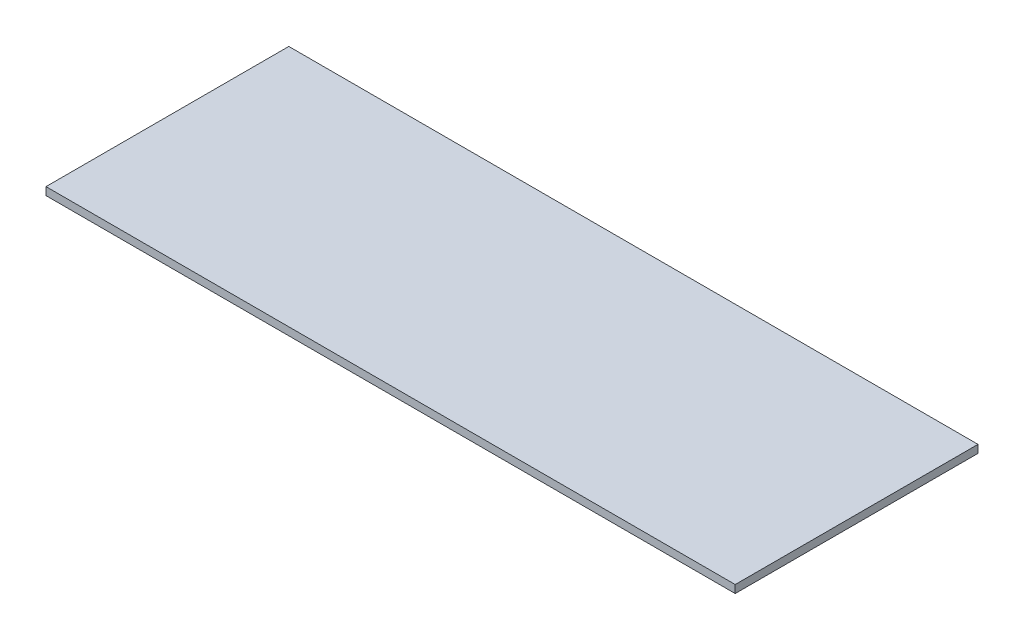
ISO-10303-21;
HEADER;
FILE_DESCRIPTION(('STEP AP214'),'2;1');
FILE_NAME('part.step','',(''),(''),'','','');
FILE_SCHEMA(('AUTOMOTIVE_DESIGN { 1 0 10303 214 1 1 1 1 }'));
ENDSEC;
DATA;
#1=APPLICATION_CONTEXT('core data for automotive mechanical design processes');
#2=APPLICATION_PROTOCOL_DEFINITION('international standard','automotive_design',2000,#1);
#3=PRODUCT_CONTEXT('',#1,'mechanical');
#4=PRODUCT('Part','Part','',(#3));
#5=PRODUCT_RELATED_PRODUCT_CATEGORY('part','',(#4));
#6=PRODUCT_DEFINITION_FORMATION('','',#4);
#7=PRODUCT_DEFINITION_CONTEXT('part definition',#1,'design');
#8=PRODUCT_DEFINITION('design','',#6,#7);
#9=PRODUCT_DEFINITION_SHAPE('','',#8);
#10=(LENGTH_UNIT() NAMED_UNIT(*) SI_UNIT(.MILLI.,.METRE.));
#11=(NAMED_UNIT(*) PLANE_ANGLE_UNIT() SI_UNIT($,.RADIAN.));
#12=(NAMED_UNIT(*) SI_UNIT($,.STERADIAN.) SOLID_ANGLE_UNIT());
#13=UNCERTAINTY_MEASURE_WITH_UNIT(LENGTH_MEASURE(1.E-05),#10,'distance_accuracy_value','');
#14=(GEOMETRIC_REPRESENTATION_CONTEXT(3) GLOBAL_UNCERTAINTY_ASSIGNED_CONTEXT((#13)) GLOBAL_UNIT_ASSIGNED_CONTEXT((#10,
#11,#12)) REPRESENTATION_CONTEXT('',''));
#15=CARTESIAN_POINT('',(0.,0.,0.));
#16=DIRECTION('',(0.,0.,1.));
#17=DIRECTION('',(1.,0.,0.));
#18=AXIS2_PLACEMENT_3D('',#15,#16,#17);
#19=CARTESIAN_POINT('',(0.,5.,0.));
#20=DIRECTION('',(1.,0.,0.));
#21=DIRECTION('',(0.,0.,-1.));
#22=AXIS2_PLACEMENT_3D('',#19,#20,#21);
#23=PLANE('',#22);
#24=DIRECTION('',(0.,0.,1.));
#25=VECTOR('',#24,1.);
#26=CARTESIAN_POINT('',(0.,0.,0.));
#27=LINE('',#26,#25);
#28=CARTESIAN_POINT('',(0.,0.,-155.));
#29=VERTEX_POINT('',#28);
#30=CARTESIAN_POINT('',(0.,0.,0.));
#31=VERTEX_POINT('',#30);
#32=EDGE_CURVE('E111',#29,#31,#27,.T.);
#33=ORIENTED_EDGE('',*,*,#32,.T.);
#34=DIRECTION('',(0.,-1.,0.));
#35=VECTOR('',#34,1.);
#36=CARTESIAN_POINT('',(0.,5.,0.));
#37=LINE('',#36,#35);
#38=CARTESIAN_POINT('',(0.,5.,0.));
#39=VERTEX_POINT('',#38);
#40=EDGE_CURVE('E11',#39,#31,#37,.T.);
#41=ORIENTED_EDGE('',*,*,#40,.F.);
#42=DIRECTION('',(0.,0.,1.));
#43=VECTOR('',#42,1.);
#44=CARTESIAN_POINT('',(0.,5.,0.));
#45=LINE('',#44,#43);
#46=CARTESIAN_POINT('',(0.,5.,-155.));
#47=VERTEX_POINT('',#46);
#48=EDGE_CURVE('E100',#47,#39,#45,.T.);
#49=ORIENTED_EDGE('',*,*,#48,.F.);
#50=DIRECTION('',(0.,-1.,0.));
#51=VECTOR('',#50,1.);
#52=CARTESIAN_POINT('',(0.,5.,-155.));
#53=LINE('',#52,#51);
#54=EDGE_CURVE('E108',#47,#29,#53,.T.);
#55=ORIENTED_EDGE('',*,*,#54,.T.);
#56=EDGE_LOOP('',(#33,#41,#49,#55));
#57=FACE_BOUND('',#56,.T.);
#58=ADVANCED_FACE('F44',(#57),#23,.F.);
#59=CARTESIAN_POINT('',(0.,5.,0.));
#60=DIRECTION('',(0.,0.,-1.));
#61=DIRECTION('',(-1.,0.,0.));
#62=AXIS2_PLACEMENT_3D('',#59,#60,#61);
#63=PLANE('',#62);
#64=DIRECTION('',(1.,0.,0.));
#65=VECTOR('',#64,1.);
#66=CARTESIAN_POINT('',(0.,0.,0.));
#67=LINE('',#66,#65);
#68=CARTESIAN_POINT('',(440.,0.,0.));
#69=VERTEX_POINT('',#68);
#70=EDGE_CURVE('E105',#31,#69,#67,.T.);
#71=ORIENTED_EDGE('',*,*,#70,.T.);
#72=DIRECTION('',(0.,-1.,0.));
#73=VECTOR('',#72,1.);
#74=CARTESIAN_POINT('',(440.,5.,0.));
#75=LINE('',#74,#73);
#76=CARTESIAN_POINT('',(440.,5.,0.));
#77=VERTEX_POINT('',#76);
#78=EDGE_CURVE('E53',#77,#69,#75,.T.);
#79=ORIENTED_EDGE('',*,*,#78,.F.);
#80=DIRECTION('',(1.,0.,0.));
#81=VECTOR('',#80,1.);
#82=CARTESIAN_POINT('',(0.,5.,0.));
#83=LINE('',#82,#81);
#84=EDGE_CURVE('E95',#39,#77,#83,.T.);
#85=ORIENTED_EDGE('',*,*,#84,.F.);
#86=ORIENTED_EDGE('',*,*,#40,.T.);
#87=EDGE_LOOP('',(#71,#79,#85,#86));
#88=FACE_BOUND('',#87,.T.);
#89=ADVANCED_FACE('F102',(#88),#63,.F.);
#90=CARTESIAN_POINT('',(440.,5.,0.));
#91=DIRECTION('',(-1.,0.,0.));
#92=DIRECTION('',(0.,0.,1.));
#93=AXIS2_PLACEMENT_3D('',#90,#91,#92);
#94=PLANE('',#93);
#95=DIRECTION('',(0.,0.,-1.));
#96=VECTOR('',#95,1.);
#97=CARTESIAN_POINT('',(440.,0.,0.));
#98=LINE('',#97,#96);
#99=CARTESIAN_POINT('',(440.,0.,-155.));
#100=VERTEX_POINT('',#99);
#101=EDGE_CURVE('E80',#69,#100,#98,.T.);
#102=ORIENTED_EDGE('',*,*,#101,.T.);
#103=DIRECTION('',(0.,-1.,0.));
#104=VECTOR('',#103,1.);
#105=CARTESIAN_POINT('',(440.,5.,-155.));
#106=LINE('',#105,#104);
#107=CARTESIAN_POINT('',(440.,5.,-155.));
#108=VERTEX_POINT('',#107);
#109=EDGE_CURVE('E101',#108,#100,#106,.T.);
#110=ORIENTED_EDGE('',*,*,#109,.F.);
#111=DIRECTION('',(0.,0.,-1.));
#112=VECTOR('',#111,1.);
#113=CARTESIAN_POINT('',(440.,5.,0.));
#114=LINE('',#113,#112);
#115=EDGE_CURVE('E94',#77,#108,#114,.T.);
#116=ORIENTED_EDGE('',*,*,#115,.F.);
#117=ORIENTED_EDGE('',*,*,#78,.T.);
#118=EDGE_LOOP('',(#102,#110,#116,#117));
#119=FACE_BOUND('',#118,.T.);
#120=ADVANCED_FACE('F103',(#119),#94,.F.);
#121=CARTESIAN_POINT('',(0.,5.,-155.));
#122=DIRECTION('',(0.,0.,1.));
#123=DIRECTION('',(1.,0.,0.));
#124=AXIS2_PLACEMENT_3D('',#121,#122,#123);
#125=PLANE('',#124);
#126=DIRECTION('',(-1.,0.,0.));
#127=VECTOR('',#126,1.);
#128=CARTESIAN_POINT('',(0.,0.,-155.));
#129=LINE('',#128,#127);
#130=EDGE_CURVE('E82',#100,#29,#129,.T.);
#131=ORIENTED_EDGE('',*,*,#130,.T.);
#132=ORIENTED_EDGE('',*,*,#54,.F.);
#133=DIRECTION('',(-1.,0.,0.));
#134=VECTOR('',#133,1.);
#135=CARTESIAN_POINT('',(0.,5.,-155.));
#136=LINE('',#135,#134);
#137=EDGE_CURVE('E62',#108,#47,#136,.T.);
#138=ORIENTED_EDGE('',*,*,#137,.F.);
#139=ORIENTED_EDGE('',*,*,#109,.T.);
#140=EDGE_LOOP('',(#131,#132,#138,#139));
#141=FACE_BOUND('',#140,.T.);
#142=ADVANCED_FACE('F128',(#141),#125,.F.);
#143=CARTESIAN_POINT('',(0.,5.,0.));
#144=DIRECTION('',(0.,-1.,0.));
#145=DIRECTION('',(0.,0.,-1.));
#146=AXIS2_PLACEMENT_3D('',#143,#144,#145);
#147=PLANE('',#146);
#148=ORIENTED_EDGE('',*,*,#48,.T.);
#149=ORIENTED_EDGE('',*,*,#84,.T.);
#150=ORIENTED_EDGE('',*,*,#115,.T.);
#151=ORIENTED_EDGE('',*,*,#137,.T.);
#152=EDGE_LOOP('',(#148,#149,#150,#151));
#153=FACE_BOUND('',#152,.T.);
#154=ADVANCED_FACE('F93',(#153),#147,.F.);
#155=CARTESIAN_POINT('',(0.,0.,0.));
#156=DIRECTION('',(0.,-1.,0.));
#157=DIRECTION('',(0.,0.,-1.));
#158=AXIS2_PLACEMENT_3D('',#155,#156,#157);
#159=PLANE('',#158);
#160=ORIENTED_EDGE('',*,*,#32,.F.);
#161=ORIENTED_EDGE('',*,*,#130,.F.);
#162=ORIENTED_EDGE('',*,*,#101,.F.);
#163=ORIENTED_EDGE('',*,*,#70,.F.);
#164=EDGE_LOOP('',(#160,#161,#162,#163));
#165=FACE_BOUND('',#164,.T.);
#166=ADVANCED_FACE('F129',(#165),#159,.T.);
#167=CLOSED_SHELL('',(#58,#89,#120,#142,#154,#166));
#168=MANIFOLD_SOLID_BREP('B2',#167);
#169=ADVANCED_BREP_SHAPE_REPRESENTATION('',(#18,#168),#14);
#170=SHAPE_DEFINITION_REPRESENTATION(#9,#169);
ENDSEC;
END-ISO-10303-21;
